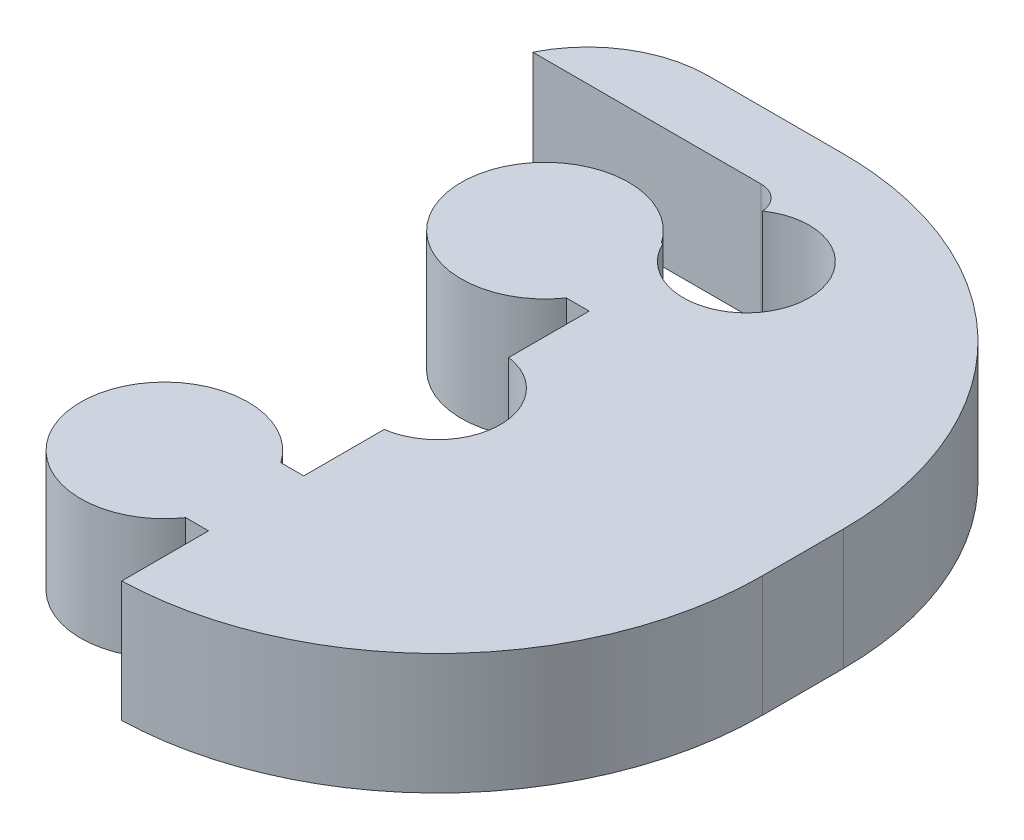
ISO-10303-21;
HEADER;
FILE_DESCRIPTION(('STEP AP214'),'2;1');
FILE_NAME('part.step','',(''),(''),'','','');
FILE_SCHEMA(('AUTOMOTIVE_DESIGN { 1 0 10303 214 1 1 1 1 }'));
ENDSEC;
DATA;
#1=APPLICATION_CONTEXT('core data for automotive mechanical design processes');
#2=APPLICATION_PROTOCOL_DEFINITION('international standard','automotive_design',2000,#1);
#3=PRODUCT_CONTEXT('',#1,'mechanical');
#4=PRODUCT('Part','Part','',(#3));
#5=PRODUCT_RELATED_PRODUCT_CATEGORY('part','',(#4));
#6=PRODUCT_DEFINITION_FORMATION('','',#4);
#7=PRODUCT_DEFINITION_CONTEXT('part definition',#1,'design');
#8=PRODUCT_DEFINITION('design','',#6,#7);
#9=PRODUCT_DEFINITION_SHAPE('','',#8);
#10=(LENGTH_UNIT() NAMED_UNIT(*) SI_UNIT(.MILLI.,.METRE.));
#11=(NAMED_UNIT(*) PLANE_ANGLE_UNIT() SI_UNIT($,.RADIAN.));
#12=(NAMED_UNIT(*) SI_UNIT($,.STERADIAN.) SOLID_ANGLE_UNIT());
#13=UNCERTAINTY_MEASURE_WITH_UNIT(LENGTH_MEASURE(1.E-05),#10,'distance_accuracy_value','');
#14=(GEOMETRIC_REPRESENTATION_CONTEXT(3) GLOBAL_UNCERTAINTY_ASSIGNED_CONTEXT((#13)) GLOBAL_UNIT_ASSIGNED_CONTEXT((#10,
#11,#12)) REPRESENTATION_CONTEXT('',''));
#15=CARTESIAN_POINT('',(0.,0.,0.));
#16=DIRECTION('',(0.,0.,1.));
#17=DIRECTION('',(1.,0.,0.));
#18=AXIS2_PLACEMENT_3D('',#15,#16,#17);
#19=CARTESIAN_POINT('',(21.2832392529259,3.175,-9.59282587209075));
#20=DIRECTION('',(-1.,0.,0.));
#21=DIRECTION('',(0.,0.,1.));
#22=AXIS2_PLACEMENT_3D('',#19,#20,#21);
#23=PLANE('',#22);
#24=DIRECTION('',(0.,0.,-1.));
#25=VECTOR('',#24,1.);
#26=CARTESIAN_POINT('',(21.2832392529259,0.,-9.59282587209075));
#27=LINE('',#26,#25);
#28=CARTESIAN_POINT('',(21.2832392529259,0.,1.07517412790925));
#29=VERTEX_POINT('',#28);
#30=CARTESIAN_POINT('',(21.2832392529259,0.,-1.05842587209075));
#31=VERTEX_POINT('',#30);
#32=EDGE_CURVE('E275',#29,#31,#27,.T.);
#33=ORIENTED_EDGE('',*,*,#32,.T.);
#34=DIRECTION('',(0.,-1.,0.));
#35=VECTOR('',#34,1.);
#36=CARTESIAN_POINT('',(21.2832392529259,3.175,-1.05842587209075));
#37=LINE('',#36,#35);
#38=CARTESIAN_POINT('',(21.2832392529259,3.175,-1.05842587209075));
#39=VERTEX_POINT('',#38);
#40=EDGE_CURVE('E268',#31,#39,#37,.F.);
#41=ORIENTED_EDGE('',*,*,#40,.T.);
#42=DIRECTION('',(0.,0.,-1.));
#43=VECTOR('',#42,1.);
#44=CARTESIAN_POINT('',(21.2832392529259,3.175,-9.59282587209075));
#45=LINE('',#44,#43);
#46=CARTESIAN_POINT('',(21.2832392529259,3.175,1.07517412790925));
#47=VERTEX_POINT('',#46);
#48=EDGE_CURVE('E252',#47,#39,#45,.T.);
#49=ORIENTED_EDGE('',*,*,#48,.F.);
#50=DIRECTION('',(0.,-1.,0.));
#51=VECTOR('',#50,1.);
#52=CARTESIAN_POINT('',(21.2832392529259,3.175,1.07517412790925));
#53=LINE('',#52,#51);
#54=EDGE_CURVE('E257',#47,#29,#53,.T.);
#55=ORIENTED_EDGE('',*,*,#54,.T.);
#56=EDGE_LOOP('',(#33,#41,#49,#55));
#57=FACE_BOUND('',#56,.T.);
#58=ADVANCED_FACE('F35',(#57),#23,.F.);
#59=CARTESIAN_POINT('',(-21.3887607470741,3.175,-9.59282587209075));
#60=DIRECTION('',(0.,0.,1.));
#61=DIRECTION('',(1.,0.,0.));
#62=AXIS2_PLACEMENT_3D('',#59,#60,#61);
#63=PLANE('',#62);
#64=DIRECTION('',(-1.,0.,0.));
#65=VECTOR('',#64,1.);
#66=CARTESIAN_POINT('',(-21.3887607470741,0.,-9.59282587209075));
#67=LINE('',#66,#65);
#68=CARTESIAN_POINT('',(12.7488392529259,0.,-9.59282587209075));
#69=VERTEX_POINT('',#68);
#70=CARTESIAN_POINT('',(9.19934151125799,0.,-9.59282587209075));
#71=VERTEX_POINT('',#70);
#72=EDGE_CURVE('E263',#69,#71,#67,.T.);
#73=ORIENTED_EDGE('',*,*,#72,.T.);
#74=DIRECTION('',(0.,1.,0.));
#75=VECTOR('',#74,1.);
#76=CARTESIAN_POINT('',(9.19934151125799,3.175,-9.59282587209075));
#77=LINE('',#76,#75);
#78=CARTESIAN_POINT('',(9.19934151125799,3.175,-9.59282587209075));
#79=VERTEX_POINT('',#78);
#80=EDGE_CURVE('E311',#71,#79,#77,.T.);
#81=ORIENTED_EDGE('',*,*,#80,.T.);
#82=DIRECTION('',(-1.,0.,0.));
#83=VECTOR('',#82,1.);
#84=CARTESIAN_POINT('',(-21.3887607470741,3.175,-9.59282587209075));
#85=LINE('',#84,#83);
#86=CARTESIAN_POINT('',(12.7488392529259,3.175,-9.59282587209075));
#87=VERTEX_POINT('',#86);
#88=EDGE_CURVE('E248',#87,#79,#85,.T.);
#89=ORIENTED_EDGE('',*,*,#88,.F.);
#90=DIRECTION('',(0.,-1.,0.));
#91=VECTOR('',#90,1.);
#92=CARTESIAN_POINT('',(12.7488392529259,3.175,-9.59282587209075));
#93=LINE('',#92,#91);
#94=EDGE_CURVE('E269',#87,#69,#93,.T.);
#95=ORIENTED_EDGE('',*,*,#94,.T.);
#96=EDGE_LOOP('',(#73,#81,#89,#95));
#97=FACE_BOUND('',#96,.T.);
#98=ADVANCED_FACE('F336',(#97),#63,.F.);
#99=CARTESIAN_POINT('',(-0.0527607470740534,3.175,0.00837412790925256));
#100=DIRECTION('',(0.,1.,0.));
#101=DIRECTION('',(0.,0.,1.));
#102=AXIS2_PLACEMENT_3D('',#99,#100,#101);
#103=PLANE('',#102);
#104=ORIENTED_EDGE('',*,*,#88,.T.);
#105=CARTESIAN_POINT('',(9.19934151125799,3.175,-6.41782587209075));
#106=DIRECTION('',(0.,1.,0.));
#107=DIRECTION('',(0.,0.,1.));
#108=AXIS2_PLACEMENT_3D('',#105,#106,#107);
#109=CIRCLE('',#108,3.175);
#110=CARTESIAN_POINT('',(6.35311925292594,3.175,-7.82482404414897));
#111=VERTEX_POINT('',#110);
#112=EDGE_CURVE('E314',#79,#111,#109,.T.);
#113=ORIENTED_EDGE('',*,*,#112,.T.);
#114=DIRECTION('',(-1.,0.,0.));
#115=VECTOR('',#114,1.);
#116=CARTESIAN_POINT('',(6.35311925292594,3.175,-7.82482404414897));
#117=LINE('',#116,#115);
#118=CARTESIAN_POINT('',(12.3510584472581,3.175,-7.82482404414897));
#119=VERTEX_POINT('',#118);
#120=EDGE_CURVE('E217',#119,#111,#117,.T.);
#121=ORIENTED_EDGE('',*,*,#120,.F.);
#122=CARTESIAN_POINT('',(12.3510584472581,3.175,-7.18982404414897));
#123=DIRECTION('',(0.,1.,0.));
#124=DIRECTION('',(0.,0.,1.));
#125=AXIS2_PLACEMENT_3D('',#122,#123,#124);
#126=CIRCLE('',#125,0.635);
#127=CARTESIAN_POINT('',(12.984828753983,3.175,-7.22932338988852));
#128=VERTEX_POINT('',#127);
#129=EDGE_CURVE('E43',#119,#128,#126,.F.);
#130=ORIENTED_EDGE('',*,*,#129,.T.);
#131=CARTESIAN_POINT('',(13.9223192529259,3.175,-5.86722717596248));
#132=DIRECTION('',(0.,1.,0.));
#133=DIRECTION('',(0.,0.,1.));
#134=AXIS2_PLACEMENT_3D('',#131,#132,#133);
#135=CIRCLE('',#134,1.65354);
#136=CARTESIAN_POINT('',(12.4207299920382,3.175,-5.17482250874364));
#137=VERTEX_POINT('',#136);
#138=EDGE_CURVE('E228',#137,#128,#135,.T.);
#139=ORIENTED_EDGE('',*,*,#138,.F.);
#140=DIRECTION('',(1.,0.,0.));
#141=VECTOR('',#140,1.);
#142=CARTESIAN_POINT('',(12.384828753983,3.175,-5.17482250874364));
#143=LINE('',#142,#141);
#144=CARTESIAN_POINT('',(12.384828753983,3.175,-5.17482250874364));
#145=VERTEX_POINT('',#144);
#146=EDGE_CURVE('E215',#145,#137,#143,.T.);
#147=ORIENTED_EDGE('',*,*,#146,.F.);
#148=CARTESIAN_POINT('',(10.5744420549598,3.175,-3.92482250874364));
#149=DIRECTION('',(0.,-1.,0.));
#150=DIRECTION('',(0.,0.,-1.));
#151=AXIS2_PLACEMENT_3D('',#148,#149,#150);
#152=CIRCLE('',#151,2.2);
#153=CARTESIAN_POINT('',(12.384828753983,3.175,-2.67482250874364));
#154=VERTEX_POINT('',#153);
#155=EDGE_CURVE('E212',#154,#145,#152,.T.);
#156=ORIENTED_EDGE('',*,*,#155,.F.);
#157=DIRECTION('',(-1.,0.,0.));
#158=VECTOR('',#157,1.);
#159=CARTESIAN_POINT('',(12.384828753983,3.175,-2.67482250874364));
#160=LINE('',#159,#158);
#161=CARTESIAN_POINT('',(12.984828753983,3.175,-2.67482250874364));
#162=VERTEX_POINT('',#161);
#163=EDGE_CURVE('E210',#162,#154,#160,.T.);
#164=ORIENTED_EDGE('',*,*,#163,.F.);
#165=DIRECTION('',(0.,0.,-1.));
#166=VECTOR('',#165,1.);
#167=CARTESIAN_POINT('',(12.984828753983,3.175,4.82517749125636));
#168=LINE('',#167,#166);
#169=CARTESIAN_POINT('',(12.984828753983,3.175,-0.561439292233345));
#170=VERTEX_POINT('',#169);
#171=EDGE_CURVE('E165',#170,#162,#168,.T.);
#172=ORIENTED_EDGE('',*,*,#171,.F.);
#173=CARTESIAN_POINT('',(12.7488392529259,3.175,1.07517412790925));
#174=DIRECTION('',(0.,1.,0.));
#175=DIRECTION('',(0.,0.,1.));
#176=AXIS2_PLACEMENT_3D('',#173,#174,#175);
#177=CIRCLE('',#176,1.65354);
#178=CARTESIAN_POINT('',(12.984828753983,3.175,2.71178754805185));
#179=VERTEX_POINT('',#178);
#180=EDGE_CURVE('E245',#179,#170,#177,.T.);
#181=ORIENTED_EDGE('',*,*,#180,.F.);
#182=CARTESIAN_POINT('',(12.984828753983,3.175,4.82517749125636));
#183=VERTEX_POINT('',#182);
#184=EDGE_CURVE('E208',#183,#179,#168,.T.);
#185=ORIENTED_EDGE('',*,*,#184,.F.);
#186=DIRECTION('',(1.,0.,0.));
#187=VECTOR('',#186,1.);
#188=CARTESIAN_POINT('',(12.384828753983,3.175,4.82517749125636));
#189=LINE('',#188,#187);
#190=CARTESIAN_POINT('',(12.384828753983,3.175,4.82517749125636));
#191=VERTEX_POINT('',#190);
#192=EDGE_CURVE('E185',#191,#183,#189,.T.);
#193=ORIENTED_EDGE('',*,*,#192,.F.);
#194=CARTESIAN_POINT('',(10.5744420549598,3.175,6.07517749125636));
#195=DIRECTION('',(0.,-1.,0.));
#196=DIRECTION('',(0.,0.,-1.));
#197=AXIS2_PLACEMENT_3D('',#194,#195,#196);
#198=CIRCLE('',#197,2.2);
#199=CARTESIAN_POINT('',(12.384828753983,3.175,7.32517749125636));
#200=VERTEX_POINT('',#199);
#201=EDGE_CURVE('E188',#200,#191,#198,.T.);
#202=ORIENTED_EDGE('',*,*,#201,.F.);
#203=DIRECTION('',(-1.,0.,0.));
#204=VECTOR('',#203,1.);
#205=CARTESIAN_POINT('',(12.984828753983,3.175,7.32517749125636));
#206=LINE('',#205,#204);
#207=CARTESIAN_POINT('',(12.984828753983,3.175,7.32517749125636));
#208=VERTEX_POINT('',#207);
#209=EDGE_CURVE('E221',#208,#200,#206,.T.);
#210=ORIENTED_EDGE('',*,*,#209,.F.);
#211=DIRECTION('',(0.,0.,-1.));
#212=VECTOR('',#211,1.);
#213=CARTESIAN_POINT('',(12.984828753983,3.175,7.32517749125636));
#214=LINE('',#213,#212);
#215=CARTESIAN_POINT('',(12.984828753983,3.175,9.60631076468813));
#216=VERTEX_POINT('',#215);
#217=EDGE_CURVE('E219',#216,#208,#214,.T.);
#218=ORIENTED_EDGE('',*,*,#217,.F.);
#219=CARTESIAN_POINT('',(12.7488392529259,3.175,9.60957412790925));
#220=CARTESIAN_POINT('',(17.748175026209,3.175,9.60957412790925));
#221=CARTESIAN_POINT('',(21.2832392529259,3.175,6.07450990119231));
#222=CARTESIAN_POINT('',(21.2832392529259,3.175,1.07517412790925));
#223=(BOUNDED_CURVE() B_SPLINE_CURVE(3,(#219,#220,#221,#222),.UNSPECIFIED.,.F.,
.F.) B_SPLINE_CURVE_WITH_KNOTS((4,4),(0.,1.),
.UNSPECIFIED.) CURVE() GEOMETRIC_REPRESENTATION_ITEM() RATIONAL_B_SPLINE_CURVE((1.,
0.804737854124365,0.804737854124365,1.)) REPRESENTATION_ITEM(''));
#224=EDGE_CURVE('E253',#216,#47,#223,.T.);
#225=ORIENTED_EDGE('',*,*,#224,.T.);
#226=ORIENTED_EDGE('',*,*,#48,.T.);
#227=CARTESIAN_POINT('',(21.2832392529259,3.175,-1.05842587209075));
#228=CARTESIAN_POINT('',(21.2832392529259,3.175,-6.0577616453738));
#229=CARTESIAN_POINT('',(17.748175026209,3.175,-9.59282587209075));
#230=CARTESIAN_POINT('',(12.7488392529259,3.175,-9.59282587209075));
#231=(BOUNDED_CURVE() B_SPLINE_CURVE(3,(#227,#228,#229,#230),.UNSPECIFIED.,.F.,
.F.) B_SPLINE_CURVE_WITH_KNOTS((4,4),(0.,1.),
.UNSPECIFIED.) CURVE() GEOMETRIC_REPRESENTATION_ITEM() RATIONAL_B_SPLINE_CURVE((1.,
0.804737854124365,0.804737854124365,1.)) REPRESENTATION_ITEM(''));
#232=EDGE_CURVE('E264',#39,#87,#231,.T.);
#233=ORIENTED_EDGE('',*,*,#232,.T.);
#234=EDGE_LOOP('',(#104,#113,#121,#130,#139,#147,#156,#164,#172,#181,#185,#193,#202,#210,#218,
#225,#226,#233));
#235=FACE_BOUND('',#234,.T.);
#236=ADVANCED_FACE('F323',(#235),#103,.T.);
#237=CARTESIAN_POINT('',(-0.0527607470740534,0.,0.00837412790925256));
#238=DIRECTION('',(0.,1.,0.));
#239=DIRECTION('',(0.,0.,1.));
#240=AXIS2_PLACEMENT_3D('',#237,#238,#239);
#241=PLANE('',#240);
#242=CARTESIAN_POINT('',(13.9223192529259,0.,-5.86722717596248));
#243=DIRECTION('',(0.,1.,0.));
#244=DIRECTION('',(0.,0.,1.));
#245=AXIS2_PLACEMENT_3D('',#242,#243,#244);
#246=CIRCLE('',#245,1.65354);
#247=CARTESIAN_POINT('',(12.4207299920382,0.,-5.17482250874364));
#248=VERTEX_POINT('',#247);
#249=CARTESIAN_POINT('',(12.984828753983,0.,-7.22932338988852));
#250=VERTEX_POINT('',#249);
#251=EDGE_CURVE('E244',#248,#250,#246,.T.);
#252=ORIENTED_EDGE('',*,*,#251,.T.);
#253=CARTESIAN_POINT('',(12.3510584472581,0.,-7.18982404414897));
#254=DIRECTION('',(0.,1.,0.));
#255=DIRECTION('',(0.,0.,1.));
#256=AXIS2_PLACEMENT_3D('',#253,#254,#255);
#257=CIRCLE('',#256,0.635);
#258=CARTESIAN_POINT('',(12.3510584472581,0.,-7.82482404414897));
#259=VERTEX_POINT('',#258);
#260=EDGE_CURVE('E11',#250,#259,#257,.T.);
#261=ORIENTED_EDGE('',*,*,#260,.T.);
#262=DIRECTION('',(-1.,0.,0.));
#263=VECTOR('',#262,1.);
#264=CARTESIAN_POINT('',(6.35311925292594,0.,-7.82482404414897));
#265=LINE('',#264,#263);
#266=CARTESIAN_POINT('',(6.35311925292594,0.,-7.82482404414897));
#267=VERTEX_POINT('',#266);
#268=EDGE_CURVE('E195',#259,#267,#265,.T.);
#269=ORIENTED_EDGE('',*,*,#268,.T.);
#270=CARTESIAN_POINT('',(9.19934151125799,0.,-6.41782587209075));
#271=DIRECTION('',(0.,1.,0.));
#272=DIRECTION('',(0.,0.,1.));
#273=AXIS2_PLACEMENT_3D('',#270,#271,#272);
#274=CIRCLE('',#273,3.175);
#275=EDGE_CURVE('E317',#267,#71,#274,.F.);
#276=ORIENTED_EDGE('',*,*,#275,.T.);
#277=ORIENTED_EDGE('',*,*,#72,.F.);
#278=CARTESIAN_POINT('',(21.2832392529259,0.,-1.05842587209075));
#279=CARTESIAN_POINT('',(21.2832392529259,0.,-6.0577616453738));
#280=CARTESIAN_POINT('',(17.748175026209,0.,-9.59282587209075));
#281=CARTESIAN_POINT('',(12.7488392529259,0.,-9.59282587209075));
#282=(BOUNDED_CURVE() B_SPLINE_CURVE(3,(#278,#279,#280,#281),.UNSPECIFIED.,.F.,
.F.) B_SPLINE_CURVE_WITH_KNOTS((4,4),(0.,1.),
.UNSPECIFIED.) CURVE() GEOMETRIC_REPRESENTATION_ITEM() RATIONAL_B_SPLINE_CURVE((1.,
0.804737854124365,0.804737854124365,1.)) REPRESENTATION_ITEM(''));
#283=EDGE_CURVE('E278',#69,#31,#282,.F.);
#284=ORIENTED_EDGE('',*,*,#283,.T.);
#285=ORIENTED_EDGE('',*,*,#32,.F.);
#286=CARTESIAN_POINT('',(12.7488392529259,0.,9.60957412790925));
#287=CARTESIAN_POINT('',(17.748175026209,0.,9.60957412790925));
#288=CARTESIAN_POINT('',(21.2832392529259,0.,6.07450990119231));
#289=CARTESIAN_POINT('',(21.2832392529259,0.,1.07517412790925));
#290=(BOUNDED_CURVE() B_SPLINE_CURVE(3,(#286,#287,#288,#289),.UNSPECIFIED.,.F.,
.F.) B_SPLINE_CURVE_WITH_KNOTS((4,4),(0.,1.),
.UNSPECIFIED.) CURVE() GEOMETRIC_REPRESENTATION_ITEM() RATIONAL_B_SPLINE_CURVE((1.,
0.804737854124365,0.804737854124365,1.)) REPRESENTATION_ITEM(''));
#291=CARTESIAN_POINT('',(12.984828753983,0.,9.60631076468813));
#292=VERTEX_POINT('',#291);
#293=EDGE_CURVE('E251',#29,#292,#290,.F.);
#294=ORIENTED_EDGE('',*,*,#293,.T.);
#295=DIRECTION('',(0.,0.,-1.));
#296=VECTOR('',#295,1.);
#297=CARTESIAN_POINT('',(12.984828753983,0.,7.32517749125636));
#298=LINE('',#297,#296);
#299=CARTESIAN_POINT('',(12.984828753983,0.,7.32517749125636));
#300=VERTEX_POINT('',#299);
#301=EDGE_CURVE('E197',#292,#300,#298,.T.);
#302=ORIENTED_EDGE('',*,*,#301,.T.);
#303=DIRECTION('',(-1.,0.,0.));
#304=VECTOR('',#303,1.);
#305=CARTESIAN_POINT('',(12.984828753983,0.,7.32517749125636));
#306=LINE('',#305,#304);
#307=CARTESIAN_POINT('',(12.384828753983,0.,7.32517749125636));
#308=VERTEX_POINT('',#307);
#309=EDGE_CURVE('E200',#300,#308,#306,.T.);
#310=ORIENTED_EDGE('',*,*,#309,.T.);
#311=CARTESIAN_POINT('',(10.5744420549598,0.,6.07517749125636));
#312=DIRECTION('',(0.,-1.,0.));
#313=DIRECTION('',(0.,0.,-1.));
#314=AXIS2_PLACEMENT_3D('',#311,#312,#313);
#315=CIRCLE('',#314,2.2);
#316=CARTESIAN_POINT('',(12.384828753983,0.,4.82517749125636));
#317=VERTEX_POINT('',#316);
#318=EDGE_CURVE('E203',#308,#317,#315,.T.);
#319=ORIENTED_EDGE('',*,*,#318,.T.);
#320=DIRECTION('',(1.,0.,0.));
#321=VECTOR('',#320,1.);
#322=CARTESIAN_POINT('',(12.384828753983,0.,4.82517749125636));
#323=LINE('',#322,#321);
#324=CARTESIAN_POINT('',(12.984828753983,0.,4.82517749125636));
#325=VERTEX_POINT('',#324);
#326=EDGE_CURVE('E170',#317,#325,#323,.T.);
#327=ORIENTED_EDGE('',*,*,#326,.T.);
#328=DIRECTION('',(0.,0.,-1.));
#329=VECTOR('',#328,1.);
#330=CARTESIAN_POINT('',(12.984828753983,0.,4.82517749125636));
#331=LINE('',#330,#329);
#332=CARTESIAN_POINT('',(12.984828753983,0.,2.71178754805185));
#333=VERTEX_POINT('',#332);
#334=EDGE_CURVE('E178',#325,#333,#331,.T.);
#335=ORIENTED_EDGE('',*,*,#334,.T.);
#336=CARTESIAN_POINT('',(12.7488392529259,0.,1.07517412790925));
#337=DIRECTION('',(0.,1.,0.));
#338=DIRECTION('',(0.,0.,1.));
#339=AXIS2_PLACEMENT_3D('',#336,#337,#338);
#340=CIRCLE('',#339,1.65354);
#341=CARTESIAN_POINT('',(12.984828753983,0.,-0.561439292233345));
#342=VERTEX_POINT('',#341);
#343=EDGE_CURVE('E184',#333,#342,#340,.T.);
#344=ORIENTED_EDGE('',*,*,#343,.T.);
#345=CARTESIAN_POINT('',(12.984828753983,0.,-2.67482250874364));
#346=VERTEX_POINT('',#345);
#347=EDGE_CURVE('E162',#342,#346,#331,.T.);
#348=ORIENTED_EDGE('',*,*,#347,.T.);
#349=DIRECTION('',(-1.,0.,0.));
#350=VECTOR('',#349,1.);
#351=CARTESIAN_POINT('',(12.384828753983,0.,-2.67482250874364));
#352=LINE('',#351,#350);
#353=CARTESIAN_POINT('',(12.384828753983,0.,-2.67482250874364));
#354=VERTEX_POINT('',#353);
#355=EDGE_CURVE('E173',#346,#354,#352,.T.);
#356=ORIENTED_EDGE('',*,*,#355,.T.);
#357=CARTESIAN_POINT('',(10.5744420549598,0.,-3.92482250874364));
#358=DIRECTION('',(0.,-1.,0.));
#359=DIRECTION('',(0.,0.,-1.));
#360=AXIS2_PLACEMENT_3D('',#357,#358,#359);
#361=CIRCLE('',#360,2.2);
#362=CARTESIAN_POINT('',(12.384828753983,0.,-5.17482250874364));
#363=VERTEX_POINT('',#362);
#364=EDGE_CURVE('E177',#354,#363,#361,.T.);
#365=ORIENTED_EDGE('',*,*,#364,.T.);
#366=DIRECTION('',(1.,0.,0.));
#367=VECTOR('',#366,1.);
#368=CARTESIAN_POINT('',(12.384828753983,0.,-5.17482250874364));
#369=LINE('',#368,#367);
#370=EDGE_CURVE('E192',#363,#248,#369,.T.);
#371=ORIENTED_EDGE('',*,*,#370,.T.);
#372=EDGE_LOOP('',(#252,#261,#269,#276,#277,#284,#285,#294,#302,#310,#319,#327,#335,#344,#348,
#356,#365,#371));
#373=FACE_BOUND('',#372,.T.);
#374=ADVANCED_FACE('F181',(#373),#241,.F.);
#375=CARTESIAN_POINT('',(12.7488392529259,3.175,1.07517412790925));
#376=DIRECTION('',(0.,-1.,0.));
#377=DIRECTION('',(0.,0.,-1.));
#378=AXIS2_PLACEMENT_3D('',#375,#376,#377);
#379=CYLINDRICAL_SURFACE('',#378,8.5344);
#380=DIRECTION('',(0.,-1.,0.));
#381=VECTOR('',#380,1.);
#382=CARTESIAN_POINT('',(12.984828753983,3.175,9.60631076468813));
#383=LINE('',#382,#381);
#384=EDGE_CURVE('E309',#292,#216,#383,.F.);
#385=ORIENTED_EDGE('',*,*,#384,.F.);
#386=ORIENTED_EDGE('',*,*,#293,.F.);
#387=ORIENTED_EDGE('',*,*,#54,.F.);
#388=ORIENTED_EDGE('',*,*,#224,.F.);
#389=EDGE_LOOP('',(#385,#386,#387,#388));
#390=FACE_BOUND('',#389,.T.);
#391=ADVANCED_FACE('F351',(#390),#379,.T.);
#392=CARTESIAN_POINT('',(12.7488392529259,0.,1.07517412790925));
#393=DIRECTION('',(0.,1.,0.));
#394=DIRECTION('',(0.,0.,1.));
#395=AXIS2_PLACEMENT_3D('',#392,#393,#394);
#396=CYLINDRICAL_SURFACE('',#395,1.65354);
#397=ORIENTED_EDGE('',*,*,#180,.T.);
#398=DIRECTION('',(0.,1.,0.));
#399=VECTOR('',#398,1.);
#400=CARTESIAN_POINT('',(12.984828753983,0.,-0.561439292233345));
#401=LINE('',#400,#399);
#402=EDGE_CURVE('E307',#170,#342,#401,.F.);
#403=ORIENTED_EDGE('',*,*,#402,.T.);
#404=ORIENTED_EDGE('',*,*,#343,.F.);
#405=DIRECTION('',(0.,1.,0.));
#406=VECTOR('',#405,1.);
#407=CARTESIAN_POINT('',(12.984828753983,0.,2.71178754805185));
#408=LINE('',#407,#406);
#409=EDGE_CURVE('E304',#333,#179,#408,.T.);
#410=ORIENTED_EDGE('',*,*,#409,.T.);
#411=EDGE_LOOP('',(#397,#403,#404,#410));
#412=FACE_BOUND('',#411,.T.);
#413=ADVANCED_FACE('F373',(#412),#396,.F.);
#414=CARTESIAN_POINT('',(13.9223192529259,0.,-5.86722717596248));
#415=DIRECTION('',(0.,1.,0.));
#416=DIRECTION('',(0.,0.,1.));
#417=AXIS2_PLACEMENT_3D('',#414,#415,#416);
#418=CYLINDRICAL_SURFACE('',#417,1.65354);
#419=ORIENTED_EDGE('',*,*,#138,.T.);
#420=DIRECTION('',(0.,1.,0.));
#421=VECTOR('',#420,1.);
#422=CARTESIAN_POINT('',(12.984828753983,0.,-7.22932338988852));
#423=LINE('',#422,#421);
#424=EDGE_CURVE('E302',#128,#250,#423,.F.);
#425=ORIENTED_EDGE('',*,*,#424,.T.);
#426=ORIENTED_EDGE('',*,*,#251,.F.);
#427=DIRECTION('',(0.,1.,0.));
#428=VECTOR('',#427,1.);
#429=CARTESIAN_POINT('',(12.4207299920382,0.,-5.17482250874364));
#430=LINE('',#429,#428);
#431=EDGE_CURVE('E295',#248,#137,#430,.T.);
#432=ORIENTED_EDGE('',*,*,#431,.T.);
#433=EDGE_LOOP('',(#419,#425,#426,#432));
#434=FACE_BOUND('',#433,.T.);
#435=ADVANCED_FACE('F326',(#434),#418,.F.);
#436=CARTESIAN_POINT('',(12.7488392529259,3.175,-1.05842587209075));
#437=DIRECTION('',(0.,-1.,0.));
#438=DIRECTION('',(0.,0.,-1.));
#439=AXIS2_PLACEMENT_3D('',#436,#437,#438);
#440=CYLINDRICAL_SURFACE('',#439,8.5344);
#441=ORIENTED_EDGE('',*,*,#232,.F.);
#442=ORIENTED_EDGE('',*,*,#40,.F.);
#443=ORIENTED_EDGE('',*,*,#283,.F.);
#444=ORIENTED_EDGE('',*,*,#94,.F.);
#445=EDGE_LOOP('',(#441,#442,#443,#444));
#446=FACE_BOUND('',#445,.T.);
#447=ADVANCED_FACE('F342',(#446),#440,.T.);
#448=CARTESIAN_POINT('',(12.384828753983,0.,-5.17482250874364));
#449=DIRECTION('',(0.,0.,1.));
#450=DIRECTION('',(1.,0.,0.));
#451=AXIS2_PLACEMENT_3D('',#448,#449,#450);
#452=PLANE('',#451);
#453=ORIENTED_EDGE('',*,*,#370,.F.);
#454=DIRECTION('',(0.,1.,0.));
#455=VECTOR('',#454,1.);
#456=CARTESIAN_POINT('',(12.384828753983,0.,-5.17482250874364));
#457=LINE('',#456,#455);
#458=EDGE_CURVE('E239',#363,#145,#457,.T.);
#459=ORIENTED_EDGE('',*,*,#458,.T.);
#460=ORIENTED_EDGE('',*,*,#146,.T.);
#461=ORIENTED_EDGE('',*,*,#431,.F.);
#462=EDGE_LOOP('',(#453,#459,#460,#461));
#463=FACE_BOUND('',#462,.T.);
#464=ADVANCED_FACE('F379',(#463),#452,.F.);
#465=CARTESIAN_POINT('',(12.984828753983,0.,4.82517749125636));
#466=DIRECTION('',(1.,0.,0.));
#467=DIRECTION('',(0.,0.,-1.));
#468=AXIS2_PLACEMENT_3D('',#465,#466,#467);
#469=PLANE('',#468);
#470=ORIENTED_EDGE('',*,*,#171,.T.);
#471=DIRECTION('',(0.,1.,0.));
#472=VECTOR('',#471,1.);
#473=CARTESIAN_POINT('',(12.984828753983,0.,-2.67482250874364));
#474=LINE('',#473,#472);
#475=EDGE_CURVE('E158',#346,#162,#474,.T.);
#476=ORIENTED_EDGE('',*,*,#475,.F.);
#477=ORIENTED_EDGE('',*,*,#347,.F.);
#478=ORIENTED_EDGE('',*,*,#402,.F.);
#479=EDGE_LOOP('',(#470,#476,#477,#478));
#480=FACE_BOUND('',#479,.T.);
#481=ADVANCED_FACE('F160',(#480),#469,.F.);
#482=CARTESIAN_POINT('',(12.384828753983,0.,-2.67482250874364));
#483=DIRECTION('',(0.,0.,-1.));
#484=DIRECTION('',(-1.,0.,0.));
#485=AXIS2_PLACEMENT_3D('',#482,#483,#484);
#486=PLANE('',#485);
#487=ORIENTED_EDGE('',*,*,#163,.T.);
#488=DIRECTION('',(0.,1.,0.));
#489=VECTOR('',#488,1.);
#490=CARTESIAN_POINT('',(12.384828753983,0.,-2.67482250874364));
#491=LINE('',#490,#489);
#492=EDGE_CURVE('E169',#354,#154,#491,.T.);
#493=ORIENTED_EDGE('',*,*,#492,.F.);
#494=ORIENTED_EDGE('',*,*,#355,.F.);
#495=ORIENTED_EDGE('',*,*,#475,.T.);
#496=EDGE_LOOP('',(#487,#493,#494,#495));
#497=FACE_BOUND('',#496,.T.);
#498=ADVANCED_FACE('F174',(#497),#486,.F.);
#499=CARTESIAN_POINT('',(10.5744420549598,0.,-3.92482250874364));
#500=DIRECTION('',(0.,1.,0.));
#501=DIRECTION('',(0.,0.,1.));
#502=AXIS2_PLACEMENT_3D('',#499,#500,#501);
#503=CYLINDRICAL_SURFACE('',#502,2.2);
#504=ORIENTED_EDGE('',*,*,#155,.T.);
#505=ORIENTED_EDGE('',*,*,#458,.F.);
#506=ORIENTED_EDGE('',*,*,#364,.F.);
#507=ORIENTED_EDGE('',*,*,#492,.T.);
#508=EDGE_LOOP('',(#504,#505,#506,#507));
#509=FACE_BOUND('',#508,.T.);
#510=ADVANCED_FACE('F376',(#509),#503,.T.);
#511=CARTESIAN_POINT('',(6.35311925292594,0.,-7.82482404414897));
#512=DIRECTION('',(0.,0.,-1.));
#513=DIRECTION('',(-1.,0.,0.));
#514=AXIS2_PLACEMENT_3D('',#511,#512,#513);
#515=PLANE('',#514);
#516=ORIENTED_EDGE('',*,*,#268,.F.);
#517=DIRECTION('',(0.,1.,0.));
#518=VECTOR('',#517,1.);
#519=CARTESIAN_POINT('',(12.3510584472581,0.,-7.82482404414897));
#520=LINE('',#519,#518);
#521=EDGE_CURVE('E319',#259,#119,#520,.T.);
#522=ORIENTED_EDGE('',*,*,#521,.T.);
#523=ORIENTED_EDGE('',*,*,#120,.T.);
#524=DIRECTION('',(0.,1.,0.));
#525=VECTOR('',#524,1.);
#526=CARTESIAN_POINT('',(6.35311925292594,0.,-7.82482404414897));
#527=LINE('',#526,#525);
#528=EDGE_CURVE('E236',#267,#111,#527,.T.);
#529=ORIENTED_EDGE('',*,*,#528,.F.);
#530=EDGE_LOOP('',(#516,#522,#523,#529));
#531=FACE_BOUND('',#530,.T.);
#532=ADVANCED_FACE('F329',(#531),#515,.F.);
#533=ORIENTED_EDGE('',*,*,#334,.F.);
#534=DIRECTION('',(0.,1.,0.));
#535=VECTOR('',#534,1.);
#536=CARTESIAN_POINT('',(12.984828753983,0.,4.82517749125636));
#537=LINE('',#536,#535);
#538=EDGE_CURVE('E226',#325,#183,#537,.T.);
#539=ORIENTED_EDGE('',*,*,#538,.T.);
#540=ORIENTED_EDGE('',*,*,#184,.T.);
#541=ORIENTED_EDGE('',*,*,#409,.F.);
#542=EDGE_LOOP('',(#533,#539,#540,#541));
#543=FACE_BOUND('',#542,.T.);
#544=ADVANCED_FACE('F370',(#543),#469,.F.);
#545=CARTESIAN_POINT('',(12.384828753983,0.,4.82517749125636));
#546=DIRECTION('',(0.,0.,1.));
#547=DIRECTION('',(1.,0.,0.));
#548=AXIS2_PLACEMENT_3D('',#545,#546,#547);
#549=PLANE('',#548);
#550=ORIENTED_EDGE('',*,*,#192,.T.);
#551=ORIENTED_EDGE('',*,*,#538,.F.);
#552=ORIENTED_EDGE('',*,*,#326,.F.);
#553=DIRECTION('',(0.,1.,0.));
#554=VECTOR('',#553,1.);
#555=CARTESIAN_POINT('',(12.384828753983,0.,4.82517749125636));
#556=LINE('',#555,#554);
#557=EDGE_CURVE('E229',#317,#191,#556,.T.);
#558=ORIENTED_EDGE('',*,*,#557,.T.);
#559=EDGE_LOOP('',(#550,#551,#552,#558));
#560=FACE_BOUND('',#559,.T.);
#561=ADVANCED_FACE('F366',(#560),#549,.F.);
#562=CARTESIAN_POINT('',(10.5744420549598,0.,6.07517749125636));
#563=DIRECTION('',(0.,1.,0.));
#564=DIRECTION('',(0.,0.,1.));
#565=AXIS2_PLACEMENT_3D('',#562,#563,#564);
#566=CYLINDRICAL_SURFACE('',#565,2.2);
#567=ORIENTED_EDGE('',*,*,#201,.T.);
#568=ORIENTED_EDGE('',*,*,#557,.F.);
#569=ORIENTED_EDGE('',*,*,#318,.F.);
#570=DIRECTION('',(0.,1.,0.));
#571=VECTOR('',#570,1.);
#572=CARTESIAN_POINT('',(12.384828753983,0.,7.32517749125636));
#573=LINE('',#572,#571);
#574=EDGE_CURVE('E231',#308,#200,#573,.T.);
#575=ORIENTED_EDGE('',*,*,#574,.T.);
#576=EDGE_LOOP('',(#567,#568,#569,#575));
#577=FACE_BOUND('',#576,.T.);
#578=ADVANCED_FACE('F362',(#577),#566,.T.);
#579=CARTESIAN_POINT('',(12.984828753983,0.,7.32517749125636));
#580=DIRECTION('',(0.,0.,-1.));
#581=DIRECTION('',(-1.,0.,0.));
#582=AXIS2_PLACEMENT_3D('',#579,#580,#581);
#583=PLANE('',#582);
#584=ORIENTED_EDGE('',*,*,#209,.T.);
#585=ORIENTED_EDGE('',*,*,#574,.F.);
#586=ORIENTED_EDGE('',*,*,#309,.F.);
#587=DIRECTION('',(0.,1.,0.));
#588=VECTOR('',#587,1.);
#589=CARTESIAN_POINT('',(12.984828753983,0.,7.32517749125636));
#590=LINE('',#589,#588);
#591=EDGE_CURVE('E233',#300,#208,#590,.T.);
#592=ORIENTED_EDGE('',*,*,#591,.T.);
#593=EDGE_LOOP('',(#584,#585,#586,#592));
#594=FACE_BOUND('',#593,.T.);
#595=ADVANCED_FACE('F358',(#594),#583,.F.);
#596=CARTESIAN_POINT('',(12.984828753983,0.,7.32517749125636));
#597=DIRECTION('',(1.,0.,0.));
#598=DIRECTION('',(0.,0.,-1.));
#599=AXIS2_PLACEMENT_3D('',#596,#597,#598);
#600=PLANE('',#599);
#601=ORIENTED_EDGE('',*,*,#384,.T.);
#602=ORIENTED_EDGE('',*,*,#217,.T.);
#603=ORIENTED_EDGE('',*,*,#591,.F.);
#604=ORIENTED_EDGE('',*,*,#301,.F.);
#605=EDGE_LOOP('',(#601,#602,#603,#604));
#606=FACE_BOUND('',#605,.T.);
#607=ADVANCED_FACE('F354',(#606),#600,.F.);
#608=CARTESIAN_POINT('',(9.19934151125799,0.,-6.41782587209075));
#609=DIRECTION('',(0.,1.,0.));
#610=DIRECTION('',(0.,0.,1.));
#611=AXIS2_PLACEMENT_3D('',#608,#609,#610);
#612=CYLINDRICAL_SURFACE('',#611,3.175);
#613=ORIENTED_EDGE('',*,*,#275,.F.);
#614=ORIENTED_EDGE('',*,*,#528,.T.);
#615=ORIENTED_EDGE('',*,*,#112,.F.);
#616=ORIENTED_EDGE('',*,*,#80,.F.);
#617=EDGE_LOOP('',(#613,#614,#615,#616));
#618=FACE_BOUND('',#617,.T.);
#619=ADVANCED_FACE('F339',(#618),#612,.T.);
#620=CARTESIAN_POINT('',(12.3510584472581,0.,-7.18982404414897));
#621=DIRECTION('',(0.,1.,0.));
#622=DIRECTION('',(0.,0.,1.));
#623=AXIS2_PLACEMENT_3D('',#620,#621,#622);
#624=CYLINDRICAL_SURFACE('',#623,0.635);
#625=ORIENTED_EDGE('',*,*,#260,.F.);
#626=ORIENTED_EDGE('',*,*,#424,.F.);
#627=ORIENTED_EDGE('',*,*,#129,.F.);
#628=ORIENTED_EDGE('',*,*,#521,.F.);
#629=EDGE_LOOP('',(#625,#626,#627,#628));
#630=FACE_BOUND('',#629,.T.);
#631=ADVANCED_FACE('F37',(#630),#624,.F.);
#632=CLOSED_SHELL('',(#58,#98,#236,#374,#391,#413,#435,#447,#464,#481,#498,#510,#532,#544,#561,
#578,#595,#607,#619,#631));
#633=MANIFOLD_SOLID_BREP('B2',#632);
#634=ADVANCED_BREP_SHAPE_REPRESENTATION('',(#18,#633),#14);
#635=SHAPE_DEFINITION_REPRESENTATION(#9,#634);
ENDSEC;
END-ISO-10303-21;
